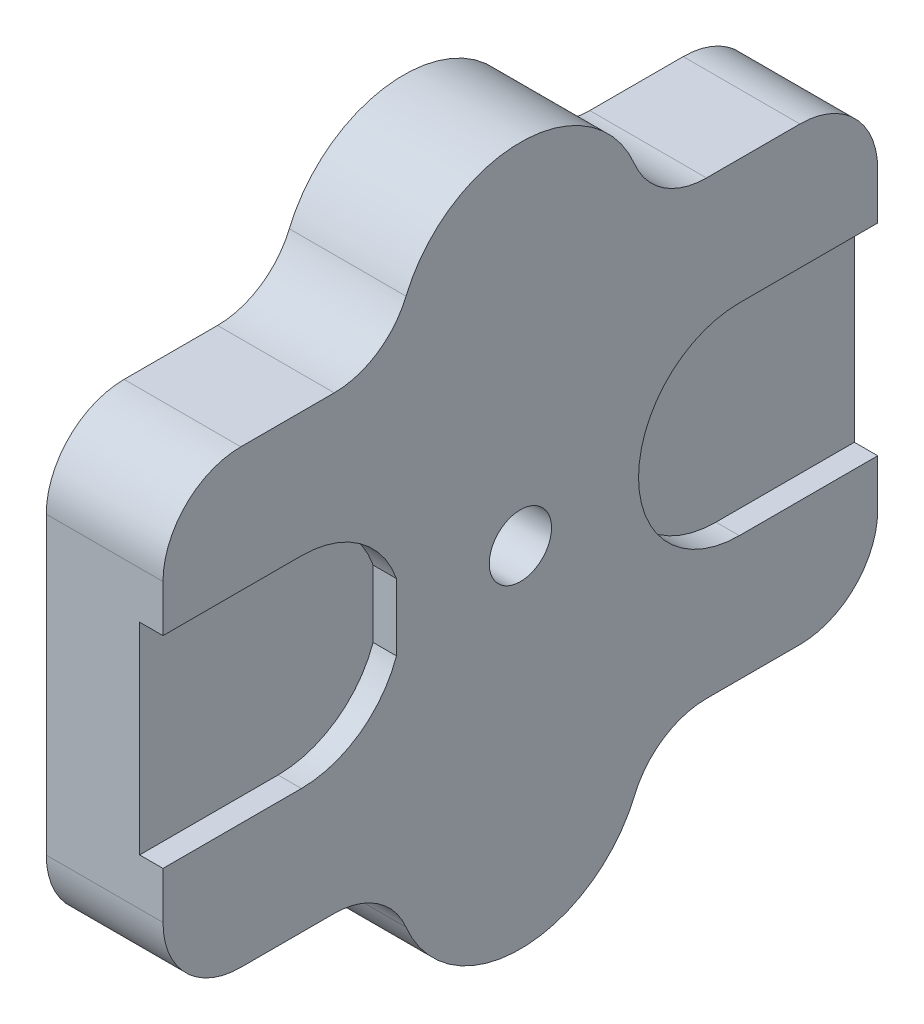
ISO-10303-21;
HEADER;
FILE_DESCRIPTION(('STEP AP214'),'2;1');
FILE_NAME('part.step','',(''),(''),'','','');
FILE_SCHEMA(('AUTOMOTIVE_DESIGN { 1 0 10303 214 1 1 1 1 }'));
ENDSEC;
DATA;
#1=APPLICATION_CONTEXT('core data for automotive mechanical design processes');
#2=APPLICATION_PROTOCOL_DEFINITION('international standard','automotive_design',2000,#1);
#3=PRODUCT_CONTEXT('',#1,'mechanical');
#4=PRODUCT('Part','Part','',(#3));
#5=PRODUCT_RELATED_PRODUCT_CATEGORY('part','',(#4));
#6=PRODUCT_DEFINITION_FORMATION('','',#4);
#7=PRODUCT_DEFINITION_CONTEXT('part definition',#1,'design');
#8=PRODUCT_DEFINITION('design','',#6,#7);
#9=PRODUCT_DEFINITION_SHAPE('','',#8);
#10=(LENGTH_UNIT() NAMED_UNIT(*) SI_UNIT(.MILLI.,.METRE.));
#11=(NAMED_UNIT(*) PLANE_ANGLE_UNIT() SI_UNIT($,.RADIAN.));
#12=(NAMED_UNIT(*) SI_UNIT($,.STERADIAN.) SOLID_ANGLE_UNIT());
#13=UNCERTAINTY_MEASURE_WITH_UNIT(LENGTH_MEASURE(1.E-05),#10,'distance_accuracy_value','');
#14=(GEOMETRIC_REPRESENTATION_CONTEXT(3) GLOBAL_UNCERTAINTY_ASSIGNED_CONTEXT((#13)) GLOBAL_UNIT_ASSIGNED_CONTEXT((#10,
#11,#12)) REPRESENTATION_CONTEXT('',''));
#15=CARTESIAN_POINT('',(0.,0.,0.));
#16=DIRECTION('',(0.,0.,1.));
#17=DIRECTION('',(1.,0.,0.));
#18=AXIS2_PLACEMENT_3D('',#15,#16,#17);
#19=CARTESIAN_POINT('',(15.,-28.9686177509747,3.13232637331732));
#20=DIRECTION('',(1.,0.,0.));
#21=DIRECTION('',(0.,0.,-1.));
#22=AXIS2_PLACEMENT_3D('',#19,#20,#21);
#23=PLANE('',#22);
#24=CARTESIAN_POINT('',(15.,0.,3.13232637331727));
#25=DIRECTION('',(-1.,0.,0.));
#26=DIRECTION('',(0.,0.,1.));
#27=AXIS2_PLACEMENT_3D('',#24,#25,#26);
#28=CIRCLE('',#27,4.);
#29=CARTESIAN_POINT('',(15.,0.,-0.867673626682733));
#30=VERTEX_POINT('',#29);
#31=EDGE_CURVE('E252',#30,#30,#28,.T.);
#32=ORIENTED_EDGE('',*,*,#31,.T.);
#33=EDGE_LOOP('',(#32));
#34=FACE_BOUND('',#33,.T.);
#35=DIRECTION('',(0.,-1.,0.));
#36=VECTOR('',#35,1.);
#37=CARTESIAN_POINT('',(15.,18.9686177509747,-42.7893341747207));
#38=LINE('',#37,#36);
#39=CARTESIAN_POINT('',(15.,-12.95,-42.7893341747207));
#40=VERTEX_POINT('',#39);
#41=CARTESIAN_POINT('',(15.,-18.9686177509747,-42.7893341747207));
#42=VERTEX_POINT('',#41);
#43=EDGE_CURVE('E264',#40,#42,#38,.T.);
#44=ORIENTED_EDGE('',*,*,#43,.F.);
#45=DIRECTION('',(0.,0.,1.));
#46=VECTOR('',#45,1.);
#47=CARTESIAN_POINT('',(15.,-12.95,-42.7893341747207));
#48=LINE('',#47,#46);
#49=CARTESIAN_POINT('',(15.,-12.95,-25.0030511371958));
#50=VERTEX_POINT('',#49);
#51=EDGE_CURVE('E237',#40,#50,#48,.T.);
#52=ORIENTED_EDGE('',*,*,#51,.T.);
#53=CARTESIAN_POINT('',(15.,0.,-25.0030511371959));
#54=DIRECTION('',(-1.,0.,0.));
#55=DIRECTION('',(0.,0.,1.));
#56=AXIS2_PLACEMENT_3D('',#53,#54,#55);
#57=CIRCLE('',#56,12.95);
#58=CARTESIAN_POINT('',(15.,12.95,-25.0030511371958));
#59=VERTEX_POINT('',#58);
#60=EDGE_CURVE('E730',#50,#59,#57,.T.);
#61=ORIENTED_EDGE('',*,*,#60,.T.);
#62=DIRECTION('',(0.,0.,-1.));
#63=VECTOR('',#62,1.);
#64=CARTESIAN_POINT('',(15.,12.95,-25.0030511371958));
#65=LINE('',#64,#63);
#66=CARTESIAN_POINT('',(15.,12.95,-42.7893341747207));
#67=VERTEX_POINT('',#66);
#68=EDGE_CURVE('E727',#59,#67,#65,.T.);
#69=ORIENTED_EDGE('',*,*,#68,.T.);
#70=CARTESIAN_POINT('',(15.,18.9686177509747,-42.7893341747207));
#71=VERTEX_POINT('',#70);
#72=EDGE_CURVE('E241',#71,#67,#38,.T.);
#73=ORIENTED_EDGE('',*,*,#72,.F.);
#74=CARTESIAN_POINT('',(15.,18.9686177509747,-32.7893341747207));
#75=DIRECTION('',(-1.,0.,0.));
#76=DIRECTION('',(0.,0.,-1.));
#77=AXIS2_PLACEMENT_3D('',#74,#75,#76);
#78=CIRCLE('',#77,10.);
#79=CARTESIAN_POINT('',(15.,28.9686177509747,-32.7893341747207));
#80=VERTEX_POINT('',#79);
#81=EDGE_CURVE('E270',#80,#71,#78,.T.);
#82=ORIENTED_EDGE('',*,*,#81,.F.);
#83=DIRECTION('',(0.,0.,-1.));
#84=VECTOR('',#83,1.);
#85=CARTESIAN_POINT('',(15.,28.9686177509747,-32.7893341747207));
#86=LINE('',#85,#84);
#87=CARTESIAN_POINT('',(15.,28.9686177509747,-20.7827836111196));
#88=VERTEX_POINT('',#87);
#89=EDGE_CURVE('E269',#88,#80,#86,.T.);
#90=ORIENTED_EDGE('',*,*,#89,.F.);
#91=CARTESIAN_POINT('',(15.,38.9686177509747,-20.7827836111196));
#92=DIRECTION('',(1.,0.,0.));
#93=DIRECTION('',(0.,0.,-1.));
#94=AXIS2_PLACEMENT_3D('',#91,#92,#93);
#95=CIRCLE('',#94,9.99999999999999);
#96=CARTESIAN_POINT('',(15.,35.1108402056403,-11.5568661819034));
#97=VERTEX_POINT('',#96);
#98=EDGE_CURVE('E272',#97,#88,#95,.T.);
#99=ORIENTED_EDGE('',*,*,#98,.F.);
#100=CARTESIAN_POINT('',(15.,28.9686177509747,3.13232637331732));
#101=DIRECTION('',(1.,0.,0.));
#102=DIRECTION('',(0.,0.,1.));
#103=AXIS2_PLACEMENT_3D('',#100,#101,#102);
#104=CIRCLE('',#103,15.921660548038);
#105=CARTESIAN_POINT('',(15.,35.1108402056403,17.821518928538));
#106=VERTEX_POINT('',#105);
#107=EDGE_CURVE('E70',#97,#106,#104,.T.);
#108=ORIENTED_EDGE('',*,*,#107,.T.);
#109=CARTESIAN_POINT('',(15.,38.9686177509747,27.0474363577541));
#110=DIRECTION('',(-1.,0.,0.));
#111=DIRECTION('',(0.,0.,1.));
#112=AXIS2_PLACEMENT_3D('',#109,#110,#111);
#113=CIRCLE('',#112,9.99999999999999);
#114=CARTESIAN_POINT('',(15.,28.9686177509747,27.0474363577541));
#115=VERTEX_POINT('',#114);
#116=EDGE_CURVE('E359',#106,#115,#113,.T.);
#117=ORIENTED_EDGE('',*,*,#116,.T.);
#118=DIRECTION('',(0.,0.,1.));
#119=VECTOR('',#118,1.);
#120=CARTESIAN_POINT('',(15.,28.9686177509747,39.0539869213552));
#121=LINE('',#120,#119);
#122=CARTESIAN_POINT('',(15.,28.9686177509747,39.0539869213552));
#123=VERTEX_POINT('',#122);
#124=EDGE_CURVE('E360',#115,#123,#121,.T.);
#125=ORIENTED_EDGE('',*,*,#124,.T.);
#126=CARTESIAN_POINT('',(15.,18.9686177509747,39.0539869213552));
#127=DIRECTION('',(1.,0.,0.));
#128=DIRECTION('',(0.,0.,1.));
#129=AXIS2_PLACEMENT_3D('',#126,#127,#128);
#130=CIRCLE('',#129,10.);
#131=CARTESIAN_POINT('',(15.,18.9686177509747,49.0539869213552));
#132=VERTEX_POINT('',#131);
#133=EDGE_CURVE('E357',#123,#132,#130,.T.);
#134=ORIENTED_EDGE('',*,*,#133,.T.);
#135=DIRECTION('',(0.,-1.,0.));
#136=VECTOR('',#135,1.);
#137=CARTESIAN_POINT('',(15.,18.9686177509747,49.0539869213552));
#138=LINE('',#137,#136);
#139=CARTESIAN_POINT('',(15.,12.95,49.0539869213552));
#140=VERTEX_POINT('',#139);
#141=EDGE_CURVE('E361',#132,#140,#138,.T.);
#142=ORIENTED_EDGE('',*,*,#141,.T.);
#143=DIRECTION('',(0.,0.,1.));
#144=VECTOR('',#143,1.);
#145=CARTESIAN_POINT('',(15.,12.95,31.2677038838304));
#146=LINE('',#145,#144);
#147=CARTESIAN_POINT('',(15.,12.95,31.2677038838304));
#148=VERTEX_POINT('',#147);
#149=EDGE_CURVE('E324',#148,#140,#146,.T.);
#150=ORIENTED_EDGE('',*,*,#149,.F.);
#151=CARTESIAN_POINT('',(15.,0.,31.2677038838304));
#152=DIRECTION('',(1.,0.,0.));
#153=DIRECTION('',(0.,0.,-1.));
#154=AXIS2_PLACEMENT_3D('',#151,#152,#153);
#155=CIRCLE('',#154,12.95);
#156=CARTESIAN_POINT('',(15.,4.30437195889774,19.0539869213552));
#157=VERTEX_POINT('',#156);
#158=EDGE_CURVE('E340',#157,#148,#155,.T.);
#159=ORIENTED_EDGE('',*,*,#158,.F.);
#160=DIRECTION('',(0.,1.,0.));
#161=VECTOR('',#160,1.);
#162=CARTESIAN_POINT('',(15.,-28.9686177509747,19.0539869213552));
#163=LINE('',#162,#161);
#164=CARTESIAN_POINT('',(15.,-4.30437195889774,19.0539869213552));
#165=VERTEX_POINT('',#164);
#166=EDGE_CURVE('E277',#165,#157,#163,.T.);
#167=ORIENTED_EDGE('',*,*,#166,.F.);
#168=CARTESIAN_POINT('',(15.,-12.95,31.2677038838304));
#169=VERTEX_POINT('',#168);
#170=EDGE_CURVE('E337',#169,#165,#155,.T.);
#171=ORIENTED_EDGE('',*,*,#170,.F.);
#172=DIRECTION('',(0.,0.,-1.));
#173=VECTOR('',#172,1.);
#174=CARTESIAN_POINT('',(15.,-12.95,49.0539869213552));
#175=LINE('',#174,#173);
#176=CARTESIAN_POINT('',(15.,-12.95,49.0539869213552));
#177=VERTEX_POINT('',#176);
#178=EDGE_CURVE('E319',#177,#169,#175,.T.);
#179=ORIENTED_EDGE('',*,*,#178,.F.);
#180=CARTESIAN_POINT('',(15.,-18.9686177509747,49.0539869213552));
#181=VERTEX_POINT('',#180);
#182=EDGE_CURVE('E362',#177,#181,#138,.T.);
#183=ORIENTED_EDGE('',*,*,#182,.T.);
#184=CARTESIAN_POINT('',(15.,-18.9686177509747,39.0539869213552));
#185=DIRECTION('',(1.,0.,0.));
#186=DIRECTION('',(0.,0.,-1.));
#187=AXIS2_PLACEMENT_3D('',#184,#185,#186);
#188=CIRCLE('',#187,10.);
#189=CARTESIAN_POINT('',(15.,-28.9686177509747,39.0539869213552));
#190=VERTEX_POINT('',#189);
#191=EDGE_CURVE('E368',#181,#190,#188,.T.);
#192=ORIENTED_EDGE('',*,*,#191,.T.);
#193=DIRECTION('',(0.,0.,-1.));
#194=VECTOR('',#193,1.);
#195=CARTESIAN_POINT('',(15.,-28.9686177509747,39.0539869213552));
#196=LINE('',#195,#194);
#197=CARTESIAN_POINT('',(15.,-28.9686177509747,27.0474363577541));
#198=VERTEX_POINT('',#197);
#199=EDGE_CURVE('E366',#190,#198,#196,.T.);
#200=ORIENTED_EDGE('',*,*,#199,.T.);
#201=CARTESIAN_POINT('',(15.,-38.9686177509747,27.0474363577541));
#202=DIRECTION('',(-1.,0.,0.));
#203=DIRECTION('',(0.,0.,-1.));
#204=AXIS2_PLACEMENT_3D('',#201,#202,#203);
#205=CIRCLE('',#204,9.99999999999999);
#206=CARTESIAN_POINT('',(15.,-35.1108402056403,17.821518928538));
#207=VERTEX_POINT('',#206);
#208=EDGE_CURVE('E367',#198,#207,#205,.T.);
#209=ORIENTED_EDGE('',*,*,#208,.T.);
#210=CARTESIAN_POINT('',(15.,-28.9686177509747,3.13232637331732));
#211=DIRECTION('',(1.,0.,0.));
#212=DIRECTION('',(0.,0.,-1.));
#213=AXIS2_PLACEMENT_3D('',#210,#211,#212);
#214=CIRCLE('',#213,15.921660548038);
#215=CARTESIAN_POINT('',(15.,-35.1108402056403,-11.5568661819034));
#216=VERTEX_POINT('',#215);
#217=EDGE_CURVE('E351',#207,#216,#214,.T.);
#218=ORIENTED_EDGE('',*,*,#217,.T.);
#219=CARTESIAN_POINT('',(15.,-38.9686177509747,-20.7827836111196));
#220=DIRECTION('',(1.,0.,0.));
#221=DIRECTION('',(0.,0.,1.));
#222=AXIS2_PLACEMENT_3D('',#219,#220,#221);
#223=CIRCLE('',#222,9.99999999999999);
#224=CARTESIAN_POINT('',(15.,-28.9686177509747,-20.7827836111196));
#225=VERTEX_POINT('',#224);
#226=EDGE_CURVE('E254',#225,#216,#223,.T.);
#227=ORIENTED_EDGE('',*,*,#226,.F.);
#228=DIRECTION('',(0.,0.,1.));
#229=VECTOR('',#228,1.);
#230=CARTESIAN_POINT('',(15.,-28.9686177509747,-32.7893341747207));
#231=LINE('',#230,#229);
#232=CARTESIAN_POINT('',(15.,-28.9686177509747,-32.7893341747207));
#233=VERTEX_POINT('',#232);
#234=EDGE_CURVE('E256',#233,#225,#231,.T.);
#235=ORIENTED_EDGE('',*,*,#234,.F.);
#236=CARTESIAN_POINT('',(15.,-18.9686177509747,-32.7893341747207));
#237=DIRECTION('',(-1.,0.,0.));
#238=DIRECTION('',(0.,0.,1.));
#239=AXIS2_PLACEMENT_3D('',#236,#237,#238);
#240=CIRCLE('',#239,10.);
#241=EDGE_CURVE('E265',#42,#233,#240,.T.);
#242=ORIENTED_EDGE('',*,*,#241,.F.);
#243=EDGE_LOOP('',(#44,#52,#61,#69,#73,#82,#90,#99,#108,#117,#125,#134,#142,#150,#159,#167,#171,
#179,#183,#192,#200,#209,#218,#227,#235,#242));
#244=FACE_BOUND('',#243,.T.);
#245=ADVANCED_FACE('F44',(#34,#244),#23,.T.);
#246=CARTESIAN_POINT('',(15.,18.9686177509747,-42.7893341747207));
#247=DIRECTION('',(0.,0.,-1.));
#248=DIRECTION('',(0.,1.,0.));
#249=AXIS2_PLACEMENT_3D('',#246,#247,#248);
#250=PLANE('',#249);
#251=DIRECTION('',(0.,-1.,0.));
#252=VECTOR('',#251,1.);
#253=CARTESIAN_POINT('',(12.,-12.95,-42.7893341747207));
#254=LINE('',#253,#252);
#255=CARTESIAN_POINT('',(12.,12.95,-42.7893341747207));
#256=VERTEX_POINT('',#255);
#257=CARTESIAN_POINT('',(12.,-12.95,-42.7893341747207));
#258=VERTEX_POINT('',#257);
#259=EDGE_CURVE('E229',#256,#258,#254,.T.);
#260=ORIENTED_EDGE('',*,*,#259,.T.);
#261=DIRECTION('',(1.,0.,0.));
#262=VECTOR('',#261,1.);
#263=CARTESIAN_POINT('',(12.,-12.95,-42.7893341747207));
#264=LINE('',#263,#262);
#265=EDGE_CURVE('E58',#258,#40,#264,.T.);
#266=ORIENTED_EDGE('',*,*,#265,.T.);
#267=ORIENTED_EDGE('',*,*,#43,.T.);
#268=DIRECTION('',(-1.,0.,0.));
#269=VECTOR('',#268,1.);
#270=CARTESIAN_POINT('',(15.,-18.9686177509747,-42.7893341747207));
#271=LINE('',#270,#269);
#272=CARTESIAN_POINT('',(0.,-18.9686177509747,-42.7893341747207));
#273=VERTEX_POINT('',#272);
#274=EDGE_CURVE('E308',#42,#273,#271,.T.);
#275=ORIENTED_EDGE('',*,*,#274,.T.);
#276=DIRECTION('',(0.,-1.,0.));
#277=VECTOR('',#276,1.);
#278=CARTESIAN_POINT('',(0.,18.9686177509747,-42.7893341747207));
#279=LINE('',#278,#277);
#280=CARTESIAN_POINT('',(0.,18.9686177509747,-42.7893341747207));
#281=VERTEX_POINT('',#280);
#282=EDGE_CURVE('E290',#281,#273,#279,.T.);
#283=ORIENTED_EDGE('',*,*,#282,.F.);
#284=DIRECTION('',(-1.,0.,0.));
#285=VECTOR('',#284,1.);
#286=CARTESIAN_POINT('',(15.,18.9686177509747,-42.7893341747207));
#287=LINE('',#286,#285);
#288=EDGE_CURVE('E303',#71,#281,#287,.T.);
#289=ORIENTED_EDGE('',*,*,#288,.F.);
#290=ORIENTED_EDGE('',*,*,#72,.T.);
#291=DIRECTION('',(1.,0.,0.));
#292=VECTOR('',#291,1.);
#293=CARTESIAN_POINT('',(12.,12.95,-42.7893341747207));
#294=LINE('',#293,#292);
#295=EDGE_CURVE('E221',#256,#67,#294,.T.);
#296=ORIENTED_EDGE('',*,*,#295,.F.);
#297=EDGE_LOOP('',(#260,#266,#267,#275,#283,#289,#290,#296));
#298=FACE_BOUND('',#297,.T.);
#299=ADVANCED_FACE('F239',(#298),#250,.T.);
#300=CARTESIAN_POINT('',(15.,-28.9686177509747,3.13232637331732));
#301=DIRECTION('',(-1.,0.,0.));
#302=DIRECTION('',(0.,0.,1.));
#303=AXIS2_PLACEMENT_3D('',#300,#301,#302);
#304=CYLINDRICAL_SURFACE('',#303,15.921660548038);
#305=DIRECTION('',(-1.,0.,0.));
#306=VECTOR('',#305,1.);
#307=CARTESIAN_POINT('',(15.,-35.1108402056403,-11.5568661819034));
#308=LINE('',#307,#306);
#309=CARTESIAN_POINT('',(0.,-35.1108402056403,-11.5568661819034));
#310=VERTEX_POINT('',#309);
#311=EDGE_CURVE('E315',#216,#310,#308,.T.);
#312=ORIENTED_EDGE('',*,*,#311,.F.);
#313=ORIENTED_EDGE('',*,*,#217,.F.);
#314=DIRECTION('',(-1.,0.,0.));
#315=VECTOR('',#314,1.);
#316=CARTESIAN_POINT('',(15.,-35.1108402056403,17.821518928538));
#317=LINE('',#316,#315);
#318=CARTESIAN_POINT('',(0.,-35.1108402056403,17.821518928538));
#319=VERTEX_POINT('',#318);
#320=EDGE_CURVE('E375',#207,#319,#317,.T.);
#321=ORIENTED_EDGE('',*,*,#320,.T.);
#322=CARTESIAN_POINT('',(0.,-28.9686177509747,3.13232637331732));
#323=DIRECTION('',(1.,0.,0.));
#324=DIRECTION('',(0.,0.,-1.));
#325=AXIS2_PLACEMENT_3D('',#322,#323,#324);
#326=CIRCLE('',#325,15.921660548038);
#327=EDGE_CURVE('E343',#319,#310,#326,.T.);
#328=ORIENTED_EDGE('',*,*,#327,.T.);
#329=EDGE_LOOP('',(#312,#313,#321,#328));
#330=FACE_BOUND('',#329,.T.);
#331=ADVANCED_FACE('F50',(#330),#304,.T.);
#332=CARTESIAN_POINT('',(12.,0.,31.2677038838304));
#333=DIRECTION('',(1.,0.,0.));
#334=DIRECTION('',(0.,0.,-1.));
#335=AXIS2_PLACEMENT_3D('',#332,#333,#334);
#336=CYLINDRICAL_SURFACE('',#335,12.95);
#337=ORIENTED_EDGE('',*,*,#170,.T.);
#338=DIRECTION('',(1.,0.,0.));
#339=VECTOR('',#338,1.);
#340=CARTESIAN_POINT('',(12.,-4.30437195889775,19.0539869213552));
#341=LINE('',#340,#339);
#342=CARTESIAN_POINT('',(12.,-4.30437195889774,19.0539869213552));
#343=VERTEX_POINT('',#342);
#344=EDGE_CURVE('E320',#165,#343,#341,.F.);
#345=ORIENTED_EDGE('',*,*,#344,.T.);
#346=CARTESIAN_POINT('',(12.,0.,31.2677038838304));
#347=DIRECTION('',(1.,0.,0.));
#348=DIRECTION('',(0.,0.,-1.));
#349=AXIS2_PLACEMENT_3D('',#346,#347,#348);
#350=CIRCLE('',#349,12.95);
#351=CARTESIAN_POINT('',(12.,-12.95,31.2677038838304));
#352=VERTEX_POINT('',#351);
#353=EDGE_CURVE('E328',#352,#343,#350,.T.);
#354=ORIENTED_EDGE('',*,*,#353,.F.);
#355=DIRECTION('',(1.,0.,0.));
#356=VECTOR('',#355,1.);
#357=CARTESIAN_POINT('',(12.,-12.95,31.2677038838304));
#358=LINE('',#357,#356);
#359=EDGE_CURVE('E346',#352,#169,#358,.T.);
#360=ORIENTED_EDGE('',*,*,#359,.T.);
#361=EDGE_LOOP('',(#337,#345,#354,#360));
#362=FACE_BOUND('',#361,.T.);
#363=ADVANCED_FACE('F442',(#362),#336,.F.);
#364=CARTESIAN_POINT('',(15.,28.9686177509747,3.13232637331732));
#365=DIRECTION('',(-1.,0.,0.));
#366=DIRECTION('',(0.,0.,1.));
#367=AXIS2_PLACEMENT_3D('',#364,#365,#366);
#368=CYLINDRICAL_SURFACE('',#367,15.921660548038);
#369=ORIENTED_EDGE('',*,*,#107,.F.);
#370=DIRECTION('',(-1.,0.,0.));
#371=VECTOR('',#370,1.);
#372=CARTESIAN_POINT('',(15.,35.1108402056403,-11.5568661819035));
#373=LINE('',#372,#371);
#374=CARTESIAN_POINT('',(0.,35.1108402056403,-11.5568661819035));
#375=VERTEX_POINT('',#374);
#376=EDGE_CURVE('E276',#97,#375,#373,.T.);
#377=ORIENTED_EDGE('',*,*,#376,.T.);
#378=CARTESIAN_POINT('',(0.,28.9686177509747,3.13232637331732));
#379=DIRECTION('',(1.,0.,0.));
#380=DIRECTION('',(0.,0.,1.));
#381=AXIS2_PLACEMENT_3D('',#378,#379,#380);
#382=CIRCLE('',#381,15.921660548038);
#383=CARTESIAN_POINT('',(0.,35.1108402056403,17.821518928538));
#384=VERTEX_POINT('',#383);
#385=EDGE_CURVE('E372',#375,#384,#382,.T.);
#386=ORIENTED_EDGE('',*,*,#385,.T.);
#387=DIRECTION('',(-1.,0.,0.));
#388=VECTOR('',#387,1.);
#389=CARTESIAN_POINT('',(15.,35.1108402056403,17.821518928538));
#390=LINE('',#389,#388);
#391=EDGE_CURVE('E52',#106,#384,#390,.T.);
#392=ORIENTED_EDGE('',*,*,#391,.F.);
#393=EDGE_LOOP('',(#369,#377,#386,#392));
#394=FACE_BOUND('',#393,.T.);
#395=ADVANCED_FACE('F438',(#394),#368,.T.);
#396=CARTESIAN_POINT('',(15.,38.9686177509747,27.0474363577541));
#397=DIRECTION('',(-1.,0.,0.));
#398=DIRECTION('',(0.,0.,1.));
#399=AXIS2_PLACEMENT_3D('',#396,#397,#398);
#400=CYLINDRICAL_SURFACE('',#399,9.99999999999999);
#401=CARTESIAN_POINT('',(0.,38.9686177509747,27.0474363577541));
#402=DIRECTION('',(-1.,0.,0.));
#403=DIRECTION('',(0.,0.,1.));
#404=AXIS2_PLACEMENT_3D('',#401,#402,#403);
#405=CIRCLE('',#404,9.99999999999999);
#406=CARTESIAN_POINT('',(0.,28.9686177509747,27.0474363577541));
#407=VERTEX_POINT('',#406);
#408=EDGE_CURVE('E376',#384,#407,#405,.T.);
#409=ORIENTED_EDGE('',*,*,#408,.T.);
#410=DIRECTION('',(-1.,0.,0.));
#411=VECTOR('',#410,1.);
#412=CARTESIAN_POINT('',(15.,28.9686177509747,27.0474363577541));
#413=LINE('',#412,#411);
#414=EDGE_CURVE('E406',#115,#407,#413,.T.);
#415=ORIENTED_EDGE('',*,*,#414,.F.);
#416=ORIENTED_EDGE('',*,*,#116,.F.);
#417=ORIENTED_EDGE('',*,*,#391,.T.);
#418=EDGE_LOOP('',(#409,#415,#416,#417));
#419=FACE_BOUND('',#418,.T.);
#420=ADVANCED_FACE('F411',(#419),#400,.F.);
#421=CARTESIAN_POINT('',(15.,28.9686177509747,39.0539869213552));
#422=DIRECTION('',(0.,-1.,0.));
#423=DIRECTION('',(0.,0.,-1.));
#424=AXIS2_PLACEMENT_3D('',#421,#422,#423);
#425=PLANE('',#424);
#426=DIRECTION('',(0.,0.,1.));
#427=VECTOR('',#426,1.);
#428=CARTESIAN_POINT('',(0.,28.9686177509747,39.0539869213552));
#429=LINE('',#428,#427);
#430=CARTESIAN_POINT('',(0.,28.9686177509747,39.0539869213552));
#431=VERTEX_POINT('',#430);
#432=EDGE_CURVE('E378',#407,#431,#429,.T.);
#433=ORIENTED_EDGE('',*,*,#432,.T.);
#434=DIRECTION('',(-1.,0.,0.));
#435=VECTOR('',#434,1.);
#436=CARTESIAN_POINT('',(15.,28.9686177509747,39.0539869213552));
#437=LINE('',#436,#435);
#438=EDGE_CURVE('E401',#123,#431,#437,.T.);
#439=ORIENTED_EDGE('',*,*,#438,.F.);
#440=ORIENTED_EDGE('',*,*,#124,.F.);
#441=ORIENTED_EDGE('',*,*,#414,.T.);
#442=EDGE_LOOP('',(#433,#439,#440,#441));
#443=FACE_BOUND('',#442,.T.);
#444=ADVANCED_FACE('F425',(#443),#425,.F.);
#445=CARTESIAN_POINT('',(15.,18.9686177509747,39.0539869213552));
#446=DIRECTION('',(-1.,0.,0.));
#447=DIRECTION('',(0.,0.,1.));
#448=AXIS2_PLACEMENT_3D('',#445,#446,#447);
#449=CYLINDRICAL_SURFACE('',#448,10.);
#450=CARTESIAN_POINT('',(0.,18.9686177509747,39.0539869213552));
#451=DIRECTION('',(1.,0.,0.));
#452=DIRECTION('',(0.,0.,1.));
#453=AXIS2_PLACEMENT_3D('',#450,#451,#452);
#454=CIRCLE('',#453,10.);
#455=CARTESIAN_POINT('',(0.,18.9686177509747,49.0539869213552));
#456=VERTEX_POINT('',#455);
#457=EDGE_CURVE('E379',#431,#456,#454,.T.);
#458=ORIENTED_EDGE('',*,*,#457,.T.);
#459=DIRECTION('',(-1.,0.,0.));
#460=VECTOR('',#459,1.);
#461=CARTESIAN_POINT('',(15.,18.9686177509747,49.0539869213552));
#462=LINE('',#461,#460);
#463=EDGE_CURVE('E397',#132,#456,#462,.T.);
#464=ORIENTED_EDGE('',*,*,#463,.F.);
#465=ORIENTED_EDGE('',*,*,#133,.F.);
#466=ORIENTED_EDGE('',*,*,#438,.T.);
#467=EDGE_LOOP('',(#458,#464,#465,#466));
#468=FACE_BOUND('',#467,.T.);
#469=ADVANCED_FACE('F426',(#468),#449,.T.);
#470=CARTESIAN_POINT('',(15.,18.9686177509747,49.0539869213552));
#471=DIRECTION('',(0.,0.,-1.));
#472=DIRECTION('',(0.,1.,0.));
#473=AXIS2_PLACEMENT_3D('',#470,#471,#472);
#474=PLANE('',#473);
#475=DIRECTION('',(0.,-1.,0.));
#476=VECTOR('',#475,1.);
#477=CARTESIAN_POINT('',(12.,-12.95,49.0539869213552));
#478=LINE('',#477,#476);
#479=CARTESIAN_POINT('',(12.,12.95,49.0539869213552));
#480=VERTEX_POINT('',#479);
#481=CARTESIAN_POINT('',(12.,-12.95,49.0539869213552));
#482=VERTEX_POINT('',#481);
#483=EDGE_CURVE('E321',#480,#482,#478,.T.);
#484=ORIENTED_EDGE('',*,*,#483,.F.);
#485=DIRECTION('',(1.,0.,0.));
#486=VECTOR('',#485,1.);
#487=CARTESIAN_POINT('',(12.,12.95,49.0539869213552));
#488=LINE('',#487,#486);
#489=EDGE_CURVE('E344',#480,#140,#488,.T.);
#490=ORIENTED_EDGE('',*,*,#489,.T.);
#491=ORIENTED_EDGE('',*,*,#141,.F.);
#492=ORIENTED_EDGE('',*,*,#463,.T.);
#493=DIRECTION('',(0.,-1.,0.));
#494=VECTOR('',#493,1.);
#495=CARTESIAN_POINT('',(0.,18.9686177509747,49.0539869213552));
#496=LINE('',#495,#494);
#497=CARTESIAN_POINT('',(0.,-18.9686177509747,49.0539869213552));
#498=VERTEX_POINT('',#497);
#499=EDGE_CURVE('E385',#456,#498,#496,.T.);
#500=ORIENTED_EDGE('',*,*,#499,.T.);
#501=DIRECTION('',(-1.,0.,0.));
#502=VECTOR('',#501,1.);
#503=CARTESIAN_POINT('',(15.,-18.9686177509747,49.0539869213552));
#504=LINE('',#503,#502);
#505=EDGE_CURVE('E396',#181,#498,#504,.T.);
#506=ORIENTED_EDGE('',*,*,#505,.F.);
#507=ORIENTED_EDGE('',*,*,#182,.F.);
#508=DIRECTION('',(1.,0.,0.));
#509=VECTOR('',#508,1.);
#510=CARTESIAN_POINT('',(12.,-12.95,49.0539869213552));
#511=LINE('',#510,#509);
#512=EDGE_CURVE('E331',#482,#177,#511,.T.);
#513=ORIENTED_EDGE('',*,*,#512,.F.);
#514=EDGE_LOOP('',(#484,#490,#491,#492,#500,#506,#507,#513));
#515=FACE_BOUND('',#514,.T.);
#516=ADVANCED_FACE('F475',(#515),#474,.F.);
#517=CARTESIAN_POINT('',(15.,-18.9686177509747,39.0539869213552));
#518=DIRECTION('',(-1.,0.,0.));
#519=DIRECTION('',(0.,0.,1.));
#520=AXIS2_PLACEMENT_3D('',#517,#518,#519);
#521=CYLINDRICAL_SURFACE('',#520,10.);
#522=CARTESIAN_POINT('',(0.,-18.9686177509747,39.0539869213552));
#523=DIRECTION('',(1.,0.,0.));
#524=DIRECTION('',(0.,0.,-1.));
#525=AXIS2_PLACEMENT_3D('',#522,#523,#524);
#526=CIRCLE('',#525,10.);
#527=CARTESIAN_POINT('',(0.,-28.9686177509747,39.0539869213552));
#528=VERTEX_POINT('',#527);
#529=EDGE_CURVE('E383',#498,#528,#526,.T.);
#530=ORIENTED_EDGE('',*,*,#529,.T.);
#531=DIRECTION('',(-1.,0.,0.));
#532=VECTOR('',#531,1.);
#533=CARTESIAN_POINT('',(15.,-28.9686177509747,39.0539869213552));
#534=LINE('',#533,#532);
#535=EDGE_CURVE('E393',#190,#528,#534,.T.);
#536=ORIENTED_EDGE('',*,*,#535,.F.);
#537=ORIENTED_EDGE('',*,*,#191,.F.);
#538=ORIENTED_EDGE('',*,*,#505,.T.);
#539=EDGE_LOOP('',(#530,#536,#537,#538));
#540=FACE_BOUND('',#539,.T.);
#541=ADVANCED_FACE('F467',(#540),#521,.T.);
#542=CARTESIAN_POINT('',(15.,-28.9686177509747,39.0539869213552));
#543=DIRECTION('',(0.,1.,0.));
#544=DIRECTION('',(0.,0.,1.));
#545=AXIS2_PLACEMENT_3D('',#542,#543,#544);
#546=PLANE('',#545);
#547=DIRECTION('',(0.,0.,-1.));
#548=VECTOR('',#547,1.);
#549=CARTESIAN_POINT('',(0.,-28.9686177509747,39.0539869213552));
#550=LINE('',#549,#548);
#551=CARTESIAN_POINT('',(0.,-28.9686177509747,27.0474363577541));
#552=VERTEX_POINT('',#551);
#553=EDGE_CURVE('E387',#528,#552,#550,.T.);
#554=ORIENTED_EDGE('',*,*,#553,.T.);
#555=DIRECTION('',(-1.,0.,0.));
#556=VECTOR('',#555,1.);
#557=CARTESIAN_POINT('',(15.,-28.9686177509747,27.0474363577541));
#558=LINE('',#557,#556);
#559=EDGE_CURVE('E391',#198,#552,#558,.T.);
#560=ORIENTED_EDGE('',*,*,#559,.F.);
#561=ORIENTED_EDGE('',*,*,#199,.F.);
#562=ORIENTED_EDGE('',*,*,#535,.T.);
#563=EDGE_LOOP('',(#554,#560,#561,#562));
#564=FACE_BOUND('',#563,.T.);
#565=ADVANCED_FACE('F469',(#564),#546,.F.);
#566=CARTESIAN_POINT('',(15.,-38.9686177509747,27.0474363577541));
#567=DIRECTION('',(-1.,0.,0.));
#568=DIRECTION('',(0.,0.,1.));
#569=AXIS2_PLACEMENT_3D('',#566,#567,#568);
#570=CYLINDRICAL_SURFACE('',#569,9.99999999999999);
#571=CARTESIAN_POINT('',(0.,-38.9686177509747,27.0474363577541));
#572=DIRECTION('',(-1.,0.,0.));
#573=DIRECTION('',(0.,0.,-1.));
#574=AXIS2_PLACEMENT_3D('',#571,#572,#573);
#575=CIRCLE('',#574,9.99999999999999);
#576=EDGE_CURVE('E353',#552,#319,#575,.T.);
#577=ORIENTED_EDGE('',*,*,#576,.T.);
#578=ORIENTED_EDGE('',*,*,#320,.F.);
#579=ORIENTED_EDGE('',*,*,#208,.F.);
#580=ORIENTED_EDGE('',*,*,#559,.T.);
#581=EDGE_LOOP('',(#577,#578,#579,#580));
#582=FACE_BOUND('',#581,.T.);
#583=ADVANCED_FACE('F462',(#582),#570,.F.);
#584=CARTESIAN_POINT('',(0.,-28.9686177509747,3.13232637331732));
#585=DIRECTION('',(1.,0.,0.));
#586=DIRECTION('',(0.,0.,-1.));
#587=AXIS2_PLACEMENT_3D('',#584,#585,#586);
#588=PLANE('',#587);
#589=ORIENTED_EDGE('',*,*,#327,.F.);
#590=ORIENTED_EDGE('',*,*,#576,.F.);
#591=ORIENTED_EDGE('',*,*,#553,.F.);
#592=ORIENTED_EDGE('',*,*,#529,.F.);
#593=ORIENTED_EDGE('',*,*,#499,.F.);
#594=ORIENTED_EDGE('',*,*,#457,.F.);
#595=ORIENTED_EDGE('',*,*,#432,.F.);
#596=ORIENTED_EDGE('',*,*,#408,.F.);
#597=ORIENTED_EDGE('',*,*,#385,.F.);
#598=CARTESIAN_POINT('',(0.,38.9686177509747,-20.7827836111196));
#599=DIRECTION('',(1.,0.,0.));
#600=DIRECTION('',(0.,0.,-1.));
#601=AXIS2_PLACEMENT_3D('',#598,#599,#600);
#602=CIRCLE('',#601,9.99999999999999);
#603=CARTESIAN_POINT('',(0.,28.9686177509747,-20.7827836111196));
#604=VERTEX_POINT('',#603);
#605=EDGE_CURVE('E259',#375,#604,#602,.T.);
#606=ORIENTED_EDGE('',*,*,#605,.T.);
#607=DIRECTION('',(0.,0.,-1.));
#608=VECTOR('',#607,1.);
#609=CARTESIAN_POINT('',(0.,28.9686177509747,-32.7893341747207));
#610=LINE('',#609,#608);
#611=CARTESIAN_POINT('',(0.,28.9686177509747,-32.7893341747207));
#612=VERTEX_POINT('',#611);
#613=EDGE_CURVE('E294',#604,#612,#610,.T.);
#614=ORIENTED_EDGE('',*,*,#613,.T.);
#615=CARTESIAN_POINT('',(0.,18.9686177509747,-32.7893341747207));
#616=DIRECTION('',(-1.,0.,0.));
#617=DIRECTION('',(0.,0.,-1.));
#618=AXIS2_PLACEMENT_3D('',#615,#616,#617);
#619=CIRCLE('',#618,10.);
#620=EDGE_CURVE('E292',#612,#281,#619,.T.);
#621=ORIENTED_EDGE('',*,*,#620,.T.);
#622=ORIENTED_EDGE('',*,*,#282,.T.);
#623=CARTESIAN_POINT('',(0.,-18.9686177509747,-32.7893341747207));
#624=DIRECTION('',(-1.,0.,0.));
#625=DIRECTION('',(0.,0.,1.));
#626=AXIS2_PLACEMENT_3D('',#623,#624,#625);
#627=CIRCLE('',#626,10.);
#628=CARTESIAN_POINT('',(0.,-28.9686177509747,-32.7893341747207));
#629=VERTEX_POINT('',#628);
#630=EDGE_CURVE('E284',#273,#629,#627,.T.);
#631=ORIENTED_EDGE('',*,*,#630,.T.);
#632=DIRECTION('',(0.,0.,1.));
#633=VECTOR('',#632,1.);
#634=CARTESIAN_POINT('',(0.,-28.9686177509747,-32.7893341747207));
#635=LINE('',#634,#633);
#636=CARTESIAN_POINT('',(0.,-28.9686177509747,-20.7827836111196));
#637=VERTEX_POINT('',#636);
#638=EDGE_CURVE('E285',#629,#637,#635,.T.);
#639=ORIENTED_EDGE('',*,*,#638,.T.);
#640=CARTESIAN_POINT('',(0.,-38.9686177509747,-20.7827836111196));
#641=DIRECTION('',(1.,0.,0.));
#642=DIRECTION('',(0.,0.,1.));
#643=AXIS2_PLACEMENT_3D('',#640,#641,#642);
#644=CIRCLE('',#643,9.99999999999999);
#645=EDGE_CURVE('E253',#637,#310,#644,.T.);
#646=ORIENTED_EDGE('',*,*,#645,.T.);
#647=EDGE_LOOP('',(#589,#590,#591,#592,#593,#594,#595,#596,#597,#606,#614,#621,#622,#631,#639,#646));
#648=FACE_BOUND('',#647,.T.);
#649=ADVANCED_FACE('F417',(#648),#588,.F.);
#650=CARTESIAN_POINT('',(12.,12.95,31.2677038838304));
#651=DIRECTION('',(0.,1.,0.));
#652=DIRECTION('',(0.,0.,1.));
#653=AXIS2_PLACEMENT_3D('',#650,#651,#652);
#654=PLANE('',#653);
#655=ORIENTED_EDGE('',*,*,#149,.T.);
#656=ORIENTED_EDGE('',*,*,#489,.F.);
#657=DIRECTION('',(0.,0.,1.));
#658=VECTOR('',#657,1.);
#659=CARTESIAN_POINT('',(12.,12.95,31.2677038838304));
#660=LINE('',#659,#658);
#661=CARTESIAN_POINT('',(12.,12.95,31.2677038838304));
#662=VERTEX_POINT('',#661);
#663=EDGE_CURVE('E332',#662,#480,#660,.T.);
#664=ORIENTED_EDGE('',*,*,#663,.F.);
#665=DIRECTION('',(1.,0.,0.));
#666=VECTOR('',#665,1.);
#667=CARTESIAN_POINT('',(12.,12.95,31.2677038838304));
#668=LINE('',#667,#666);
#669=EDGE_CURVE('E342',#662,#148,#668,.T.);
#670=ORIENTED_EDGE('',*,*,#669,.T.);
#671=EDGE_LOOP('',(#655,#656,#664,#670));
#672=FACE_BOUND('',#671,.T.);
#673=ADVANCED_FACE('F465',(#672),#654,.F.);
#674=CARTESIAN_POINT('',(12.,4.30437195889774,19.0539869213552));
#675=VERTEX_POINT('',#674);
#676=EDGE_CURVE('E327',#675,#662,#350,.T.);
#677=ORIENTED_EDGE('',*,*,#676,.F.);
#678=DIRECTION('',(1.,0.,0.));
#679=VECTOR('',#678,1.);
#680=CARTESIAN_POINT('',(12.,4.30437195889775,19.0539869213552));
#681=LINE('',#680,#679);
#682=EDGE_CURVE('E312',#675,#157,#681,.T.);
#683=ORIENTED_EDGE('',*,*,#682,.T.);
#684=ORIENTED_EDGE('',*,*,#158,.T.);
#685=ORIENTED_EDGE('',*,*,#669,.F.);
#686=EDGE_LOOP('',(#677,#683,#684,#685));
#687=FACE_BOUND('',#686,.T.);
#688=ADVANCED_FACE('F449',(#687),#336,.F.);
#689=CARTESIAN_POINT('',(12.,-12.95,49.0539869213552));
#690=DIRECTION('',(0.,-1.,0.));
#691=DIRECTION('',(0.,0.,-1.));
#692=AXIS2_PLACEMENT_3D('',#689,#690,#691);
#693=PLANE('',#692);
#694=ORIENTED_EDGE('',*,*,#178,.T.);
#695=ORIENTED_EDGE('',*,*,#359,.F.);
#696=DIRECTION('',(0.,0.,-1.));
#697=VECTOR('',#696,1.);
#698=CARTESIAN_POINT('',(12.,-12.95,49.0539869213552));
#699=LINE('',#698,#697);
#700=EDGE_CURVE('E322',#482,#352,#699,.T.);
#701=ORIENTED_EDGE('',*,*,#700,.F.);
#702=ORIENTED_EDGE('',*,*,#512,.T.);
#703=EDGE_LOOP('',(#694,#695,#701,#702));
#704=FACE_BOUND('',#703,.T.);
#705=ADVANCED_FACE('F458',(#704),#693,.F.);
#706=CARTESIAN_POINT('',(12.,0.,31.2677038838304));
#707=DIRECTION('',(1.,0.,0.));
#708=DIRECTION('',(0.,0.,-1.));
#709=AXIS2_PLACEMENT_3D('',#706,#707,#708);
#710=PLANE('',#709);
#711=DIRECTION('',(0.,-1.,0.));
#712=VECTOR('',#711,1.);
#713=CARTESIAN_POINT('',(12.,0.,19.0539869213552));
#714=LINE('',#713,#712);
#715=EDGE_CURVE('E11',#675,#343,#714,.T.);
#716=ORIENTED_EDGE('',*,*,#715,.F.);
#717=ORIENTED_EDGE('',*,*,#676,.T.);
#718=ORIENTED_EDGE('',*,*,#663,.T.);
#719=ORIENTED_EDGE('',*,*,#483,.T.);
#720=ORIENTED_EDGE('',*,*,#700,.T.);
#721=ORIENTED_EDGE('',*,*,#353,.T.);
#722=EDGE_LOOP('',(#716,#717,#718,#719,#720,#721));
#723=FACE_BOUND('',#722,.T.);
#724=ADVANCED_FACE('F526',(#723),#710,.T.);
#725=CARTESIAN_POINT('',(15.,-28.9686177509747,19.0539869213552));
#726=DIRECTION('',(0.,0.,1.));
#727=DIRECTION('',(1.,0.,0.));
#728=AXIS2_PLACEMENT_3D('',#725,#726,#727);
#729=PLANE('',#728);
#730=ORIENTED_EDGE('',*,*,#344,.F.);
#731=ORIENTED_EDGE('',*,*,#166,.T.);
#732=ORIENTED_EDGE('',*,*,#682,.F.);
#733=ORIENTED_EDGE('',*,*,#715,.T.);
#734=EDGE_LOOP('',(#730,#731,#732,#733));
#735=FACE_BOUND('',#734,.T.);
#736=ADVANCED_FACE('F561',(#735),#729,.T.);
#737=CARTESIAN_POINT('',(15.,-38.9686177509747,-20.7827836111196));
#738=DIRECTION('',(-1.,0.,0.));
#739=DIRECTION('',(0.,0.,1.));
#740=AXIS2_PLACEMENT_3D('',#737,#738,#739);
#741=CYLINDRICAL_SURFACE('',#740,9.99999999999999);
#742=ORIENTED_EDGE('',*,*,#645,.F.);
#743=DIRECTION('',(-1.,0.,0.));
#744=VECTOR('',#743,1.);
#745=CARTESIAN_POINT('',(15.,-28.9686177509747,-20.7827836111196));
#746=LINE('',#745,#744);
#747=EDGE_CURVE('E309',#225,#637,#746,.T.);
#748=ORIENTED_EDGE('',*,*,#747,.F.);
#749=ORIENTED_EDGE('',*,*,#226,.T.);
#750=ORIENTED_EDGE('',*,*,#311,.T.);
#751=EDGE_LOOP('',(#742,#748,#749,#750));
#752=FACE_BOUND('',#751,.T.);
#753=ADVANCED_FACE('F603',(#752),#741,.F.);
#754=CARTESIAN_POINT('',(15.,-28.9686177509747,-32.7893341747207));
#755=DIRECTION('',(0.,-1.,0.));
#756=DIRECTION('',(0.,0.,-1.));
#757=AXIS2_PLACEMENT_3D('',#754,#755,#756);
#758=PLANE('',#757);
#759=ORIENTED_EDGE('',*,*,#638,.F.);
#760=DIRECTION('',(-1.,0.,0.));
#761=VECTOR('',#760,1.);
#762=CARTESIAN_POINT('',(15.,-28.9686177509747,-32.7893341747207));
#763=LINE('',#762,#761);
#764=EDGE_CURVE('E306',#233,#629,#763,.T.);
#765=ORIENTED_EDGE('',*,*,#764,.F.);
#766=ORIENTED_EDGE('',*,*,#234,.T.);
#767=ORIENTED_EDGE('',*,*,#747,.T.);
#768=EDGE_LOOP('',(#759,#765,#766,#767));
#769=FACE_BOUND('',#768,.T.);
#770=ADVANCED_FACE('F613',(#769),#758,.T.);
#771=CARTESIAN_POINT('',(15.,-18.9686177509747,-32.7893341747207));
#772=DIRECTION('',(-1.,0.,0.));
#773=DIRECTION('',(0.,0.,1.));
#774=AXIS2_PLACEMENT_3D('',#771,#772,#773);
#775=CYLINDRICAL_SURFACE('',#774,10.);
#776=ORIENTED_EDGE('',*,*,#630,.F.);
#777=ORIENTED_EDGE('',*,*,#274,.F.);
#778=ORIENTED_EDGE('',*,*,#241,.T.);
#779=ORIENTED_EDGE('',*,*,#764,.T.);
#780=EDGE_LOOP('',(#776,#777,#778,#779));
#781=FACE_BOUND('',#780,.T.);
#782=ADVANCED_FACE('F624',(#781),#775,.T.);
#783=CARTESIAN_POINT('',(15.,18.9686177509747,-32.7893341747207));
#784=DIRECTION('',(-1.,0.,0.));
#785=DIRECTION('',(0.,0.,1.));
#786=AXIS2_PLACEMENT_3D('',#783,#784,#785);
#787=CYLINDRICAL_SURFACE('',#786,10.);
#788=ORIENTED_EDGE('',*,*,#620,.F.);
#789=DIRECTION('',(-1.,0.,0.));
#790=VECTOR('',#789,1.);
#791=CARTESIAN_POINT('',(15.,28.9686177509747,-32.7893341747207));
#792=LINE('',#791,#790);
#793=EDGE_CURVE('E301',#80,#612,#792,.T.);
#794=ORIENTED_EDGE('',*,*,#793,.F.);
#795=ORIENTED_EDGE('',*,*,#81,.T.);
#796=ORIENTED_EDGE('',*,*,#288,.T.);
#797=EDGE_LOOP('',(#788,#794,#795,#796));
#798=FACE_BOUND('',#797,.T.);
#799=ADVANCED_FACE('F633',(#798),#787,.T.);
#800=CARTESIAN_POINT('',(15.,28.9686177509747,-32.7893341747207));
#801=DIRECTION('',(0.,1.,0.));
#802=DIRECTION('',(0.,0.,1.));
#803=AXIS2_PLACEMENT_3D('',#800,#801,#802);
#804=PLANE('',#803);
#805=ORIENTED_EDGE('',*,*,#613,.F.);
#806=DIRECTION('',(-1.,0.,0.));
#807=VECTOR('',#806,1.);
#808=CARTESIAN_POINT('',(15.,28.9686177509747,-20.7827836111196));
#809=LINE('',#808,#807);
#810=EDGE_CURVE('E299',#88,#604,#809,.T.);
#811=ORIENTED_EDGE('',*,*,#810,.F.);
#812=ORIENTED_EDGE('',*,*,#89,.T.);
#813=ORIENTED_EDGE('',*,*,#793,.T.);
#814=EDGE_LOOP('',(#805,#811,#812,#813));
#815=FACE_BOUND('',#814,.T.);
#816=ADVANCED_FACE('F644',(#815),#804,.T.);
#817=CARTESIAN_POINT('',(15.,38.9686177509747,-20.7827836111196));
#818=DIRECTION('',(-1.,0.,0.));
#819=DIRECTION('',(0.,0.,1.));
#820=AXIS2_PLACEMENT_3D('',#817,#818,#819);
#821=CYLINDRICAL_SURFACE('',#820,9.99999999999999);
#822=ORIENTED_EDGE('',*,*,#605,.F.);
#823=ORIENTED_EDGE('',*,*,#376,.F.);
#824=ORIENTED_EDGE('',*,*,#98,.T.);
#825=ORIENTED_EDGE('',*,*,#810,.T.);
#826=EDGE_LOOP('',(#822,#823,#824,#825));
#827=FACE_BOUND('',#826,.T.);
#828=ADVANCED_FACE('F440',(#827),#821,.F.);
#829=CARTESIAN_POINT('',(0.953799999999999,0.,3.13232637331727));
#830=DIRECTION('',(1.,0.,0.));
#831=DIRECTION('',(0.,0.,-1.));
#832=AXIS2_PLACEMENT_3D('',#829,#830,#831);
#833=CYLINDRICAL_SURFACE('',#832,4.);
#834=CARTESIAN_POINT('',(0.953799999999999,0.,3.13232637331727));
#835=DIRECTION('',(-1.,0.,0.));
#836=DIRECTION('',(0.,0.,1.));
#837=AXIS2_PLACEMENT_3D('',#834,#835,#836);
#838=CIRCLE('',#837,4.);
#839=CARTESIAN_POINT('',(0.953799999999999,0.,-0.867673626682733));
#840=VERTEX_POINT('',#839);
#841=EDGE_CURVE('E250',#840,#840,#838,.T.);
#842=CARTESIAN_POINT('',(0.953799999999999,0.,-0.867673626682733));
#843=CARTESIAN_POINT('',(1.10011458333333,0.,-0.867673626682733));
#844=CARTESIAN_POINT('',(1.24642916666667,0.,-0.867673626682733));
#845=CARTESIAN_POINT('',(1.53905833333333,0.,-0.867673626682733));
#846=CARTESIAN_POINT('',(1.68537291666667,0.,-0.867673626682733));
#847=CARTESIAN_POINT('',(1.97800208333333,0.,-0.867673626682733));
#848=CARTESIAN_POINT('',(2.12431666666667,0.,-0.867673626682733));
#849=CARTESIAN_POINT('',(2.41694583333333,0.,-0.867673626682733));
#850=CARTESIAN_POINT('',(2.56326041666667,0.,-0.867673626682733));
#851=CARTESIAN_POINT('',(2.85588958333333,0.,-0.867673626682733));
#852=CARTESIAN_POINT('',(3.00220416666667,0.,-0.867673626682733));
#853=CARTESIAN_POINT('',(3.29483333333333,0.,-0.867673626682733));
#854=CARTESIAN_POINT('',(3.44114791666667,0.,-0.867673626682733));
#855=CARTESIAN_POINT('',(3.73377708333333,0.,-0.867673626682733));
#856=CARTESIAN_POINT('',(3.88009166666667,0.,-0.867673626682733));
#857=CARTESIAN_POINT('',(4.17272083333333,0.,-0.867673626682733));
#858=CARTESIAN_POINT('',(4.31903541666667,0.,-0.867673626682733));
#859=CARTESIAN_POINT('',(4.61166458333333,0.,-0.867673626682733));
#860=CARTESIAN_POINT('',(4.75797916666667,0.,-0.867673626682733));
#861=CARTESIAN_POINT('',(5.05060833333333,0.,-0.867673626682733));
#862=CARTESIAN_POINT('',(5.19692291666667,0.,-0.867673626682733));
#863=CARTESIAN_POINT('',(5.48955208333333,0.,-0.867673626682733));
#864=CARTESIAN_POINT('',(5.63586666666667,0.,-0.867673626682733));
#865=CARTESIAN_POINT('',(5.92849583333333,0.,-0.867673626682733));
#866=CARTESIAN_POINT('',(6.07481041666667,0.,-0.867673626682733));
#867=CARTESIAN_POINT('',(6.36743958333333,0.,-0.867673626682733));
#868=CARTESIAN_POINT('',(6.51375416666667,0.,-0.867673626682733));
#869=CARTESIAN_POINT('',(6.80638333333333,0.,-0.867673626682733));
#870=CARTESIAN_POINT('',(6.95269791666667,0.,-0.867673626682733));
#871=CARTESIAN_POINT('',(7.24532708333333,0.,-0.867673626682733));
#872=CARTESIAN_POINT('',(7.39164166666667,0.,-0.867673626682733));
#873=CARTESIAN_POINT('',(7.68427083333333,0.,-0.867673626682733));
#874=CARTESIAN_POINT('',(7.83058541666667,0.,-0.867673626682733));
#875=CARTESIAN_POINT('',(8.12321458333333,0.,-0.867673626682733));
#876=CARTESIAN_POINT('',(8.26952916666667,0.,-0.867673626682733));
#877=CARTESIAN_POINT('',(8.56215833333333,0.,-0.867673626682733));
#878=CARTESIAN_POINT('',(8.70847291666667,0.,-0.867673626682733));
#879=CARTESIAN_POINT('',(9.00110208333333,0.,-0.867673626682733));
#880=CARTESIAN_POINT('',(9.14741666666667,0.,-0.867673626682733));
#881=CARTESIAN_POINT('',(9.44004583333333,0.,-0.867673626682733));
#882=CARTESIAN_POINT('',(9.58636041666667,0.,-0.867673626682733));
#883=CARTESIAN_POINT('',(9.87898958333333,0.,-0.867673626682733));
#884=CARTESIAN_POINT('',(10.0253041666667,0.,-0.867673626682733));
#885=CARTESIAN_POINT('',(10.3179333333333,0.,-0.867673626682733));
#886=CARTESIAN_POINT('',(10.4642479166667,0.,-0.867673626682733));
#887=CARTESIAN_POINT('',(10.7568770833333,0.,-0.867673626682733));
#888=CARTESIAN_POINT('',(10.9031916666667,0.,-0.867673626682733));
#889=CARTESIAN_POINT('',(11.1958208333333,0.,-0.867673626682733));
#890=CARTESIAN_POINT('',(11.3421354166667,0.,-0.867673626682733));
#891=CARTESIAN_POINT('',(11.6347645833333,0.,-0.867673626682733));
#892=CARTESIAN_POINT('',(11.7810791666667,0.,-0.867673626682733));
#893=CARTESIAN_POINT('',(12.0737083333333,0.,-0.867673626682733));
#894=CARTESIAN_POINT('',(12.2200229166667,0.,-0.867673626682733));
#895=CARTESIAN_POINT('',(12.5126520833333,0.,-0.867673626682733));
#896=CARTESIAN_POINT('',(12.6589666666667,0.,-0.867673626682733));
#897=CARTESIAN_POINT('',(12.9515958333333,0.,-0.867673626682733));
#898=CARTESIAN_POINT('',(13.0979104166667,0.,-0.867673626682733));
#899=CARTESIAN_POINT('',(13.3905395833333,0.,-0.867673626682733));
#900=CARTESIAN_POINT('',(13.5368541666667,0.,-0.867673626682733));
#901=CARTESIAN_POINT('',(13.8294833333333,0.,-0.867673626682733));
#902=CARTESIAN_POINT('',(13.9757979166667,0.,-0.867673626682733));
#903=CARTESIAN_POINT('',(14.2684270833333,0.,-0.867673626682733));
#904=CARTESIAN_POINT('',(14.4147416666667,0.,-0.867673626682733));
#905=CARTESIAN_POINT('',(14.7073708333333,0.,-0.867673626682733));
#906=CARTESIAN_POINT('',(14.8536854166667,0.,-0.867673626682733));
#907=CARTESIAN_POINT('',(15.,0.,-0.867673626682733));
#908=B_SPLINE_CURVE_WITH_KNOTS('',3,(#842,#843,#844,#845,#846,#847,#848,#849,#850,#851,#852,
#853,#854,#855,#856,#857,#858,#859,#860,#861,#862,#863,#864,#865,#866,#867,#868,#869,#870,#871,
#872,#873,#874,#875,#876,#877,#878,#879,#880,#881,#882,#883,#884,#885,#886,#887,#888,#889,#890,
#891,#892,#893,#894,#895,#896,#897,#898,#899,#900,#901,#902,#903,#904,#905,#906,#907),
.UNSPECIFIED.,.F.,.F.,(4,2,2,2,2,2,2,2,2,2,2,2,2,2,2,2,2,2,2,2,2,2,2,2,2,2,2,2,2,2,2,2,4),(0.,
0.43894375,0.8778875,1.31683125,1.755775,2.19471875,2.6336625,3.07260625,3.51155,3.95049375,
4.3894375,4.82838125,5.267325,5.70626875,6.1452125,6.58415625,7.0231,7.46204375,7.9009875,
8.33993125,8.778875,9.21781875,9.6567625,10.09570625,10.53465,10.97359375,11.4125375,
11.85148125,12.290425,12.72936875,13.1683125,13.60725625,14.0462),.UNSPECIFIED.);
#909=EDGE_CURVE('BSEAM664',#840,#30,#908,.T.);
#910=ORIENTED_EDGE('',*,*,#841,.T.);
#911=ORIENTED_EDGE('',*,*,#31,.F.);
#912=ORIENTED_EDGE('',*,*,#909,.T.);
#913=ORIENTED_EDGE('',*,*,#909,.F.);
#914=EDGE_LOOP('',(#910,#912,#911,#913));
#915=FACE_BOUND('',#914,.T.);
#916=ADVANCED_FACE('F664',(#915),#833,.F.);
#917=CARTESIAN_POINT('',(0.953799999999999,0.,3.13232637331727));
#918=DIRECTION('',(1.,0.,0.));
#919=DIRECTION('',(0.,0.,1.));
#920=AXIS2_PLACEMENT_3D('',#917,#918,#919);
#921=PLANE('',#920);
#922=ORIENTED_EDGE('',*,*,#841,.F.);
#923=EDGE_LOOP('',(#922));
#924=FACE_BOUND('',#923,.T.);
#925=ADVANCED_FACE('F671',(#924),#921,.T.);
#926=CARTESIAN_POINT('',(12.,-12.95,-42.7893341747207));
#927=DIRECTION('',(0.,1.,0.));
#928=DIRECTION('',(0.,0.,1.));
#929=AXIS2_PLACEMENT_3D('',#926,#927,#928);
#930=PLANE('',#929);
#931=ORIENTED_EDGE('',*,*,#51,.F.);
#932=ORIENTED_EDGE('',*,*,#265,.F.);
#933=DIRECTION('',(0.,0.,1.));
#934=VECTOR('',#933,1.);
#935=CARTESIAN_POINT('',(12.,-12.95,-42.7893341747207));
#936=LINE('',#935,#934);
#937=CARTESIAN_POINT('',(12.,-12.95,-25.0030511371958));
#938=VERTEX_POINT('',#937);
#939=EDGE_CURVE('E233',#258,#938,#936,.T.);
#940=ORIENTED_EDGE('',*,*,#939,.T.);
#941=DIRECTION('',(1.,0.,0.));
#942=VECTOR('',#941,1.);
#943=CARTESIAN_POINT('',(12.,-12.95,-25.0030511371958));
#944=LINE('',#943,#942);
#945=EDGE_CURVE('E242',#938,#50,#944,.T.);
#946=ORIENTED_EDGE('',*,*,#945,.T.);
#947=EDGE_LOOP('',(#931,#932,#940,#946));
#948=FACE_BOUND('',#947,.T.);
#949=ADVANCED_FACE('F678',(#948),#930,.T.);
#950=CARTESIAN_POINT('',(12.,0.,-25.0030511371959));
#951=DIRECTION('',(1.,0.,0.));
#952=DIRECTION('',(0.,0.,-1.));
#953=AXIS2_PLACEMENT_3D('',#950,#951,#952);
#954=CYLINDRICAL_SURFACE('',#953,12.95);
#955=ORIENTED_EDGE('',*,*,#60,.F.);
#956=ORIENTED_EDGE('',*,*,#945,.F.);
#957=CARTESIAN_POINT('',(12.,0.,-25.0030511371959));
#958=DIRECTION('',(-1.,0.,0.));
#959=DIRECTION('',(0.,0.,1.));
#960=AXIS2_PLACEMENT_3D('',#957,#958,#959);
#961=CIRCLE('',#960,12.95);
#962=CARTESIAN_POINT('',(12.,12.95,-25.0030511371958));
#963=VERTEX_POINT('',#962);
#964=EDGE_CURVE('E228',#938,#963,#961,.T.);
#965=ORIENTED_EDGE('',*,*,#964,.T.);
#966=DIRECTION('',(1.,0.,0.));
#967=VECTOR('',#966,1.);
#968=CARTESIAN_POINT('',(12.,12.95,-25.0030511371958));
#969=LINE('',#968,#967);
#970=EDGE_CURVE('E226',#963,#59,#969,.T.);
#971=ORIENTED_EDGE('',*,*,#970,.T.);
#972=EDGE_LOOP('',(#955,#956,#965,#971));
#973=FACE_BOUND('',#972,.T.);
#974=ADVANCED_FACE('F700',(#973),#954,.F.);
#975=CARTESIAN_POINT('',(12.,12.95,-25.0030511371958));
#976=DIRECTION('',(0.,-1.,0.));
#977=DIRECTION('',(0.,0.,-1.));
#978=AXIS2_PLACEMENT_3D('',#975,#976,#977);
#979=PLANE('',#978);
#980=ORIENTED_EDGE('',*,*,#68,.F.);
#981=ORIENTED_EDGE('',*,*,#970,.F.);
#982=DIRECTION('',(0.,0.,-1.));
#983=VECTOR('',#982,1.);
#984=CARTESIAN_POINT('',(12.,12.95,-25.0030511371958));
#985=LINE('',#984,#983);
#986=EDGE_CURVE('E218',#963,#256,#985,.T.);
#987=ORIENTED_EDGE('',*,*,#986,.T.);
#988=ORIENTED_EDGE('',*,*,#295,.T.);
#989=EDGE_LOOP('',(#980,#981,#987,#988));
#990=FACE_BOUND('',#989,.T.);
#991=ADVANCED_FACE('F225',(#990),#979,.T.);
#992=CARTESIAN_POINT('',(12.,0.,-25.0030511371959));
#993=DIRECTION('',(1.,0.,0.));
#994=DIRECTION('',(0.,0.,1.));
#995=AXIS2_PLACEMENT_3D('',#992,#993,#994);
#996=PLANE('',#995);
#997=ORIENTED_EDGE('',*,*,#259,.F.);
#998=ORIENTED_EDGE('',*,*,#986,.F.);
#999=ORIENTED_EDGE('',*,*,#964,.F.);
#1000=ORIENTED_EDGE('',*,*,#939,.F.);
#1001=EDGE_LOOP('',(#997,#998,#999,#1000));
#1002=FACE_BOUND('',#1001,.T.);
#1003=ADVANCED_FACE('F235',(#1002),#996,.T.);
#1004=CLOSED_SHELL('',(#245,#299,#331,#363,#395,#420,#444,#469,#516,#541,#565,#583,#649,#673,
#688,#705,#724,#736,#753,#770,#782,#799,#816,#828,#916,#925,#949,#974,#991,#1003));
#1005=MANIFOLD_SOLID_BREP('B2',#1004);
#1006=ADVANCED_BREP_SHAPE_REPRESENTATION('',(#18,#1005),#14);
#1007=SHAPE_DEFINITION_REPRESENTATION(#9,#1006);
ENDSEC;
END-ISO-10303-21;
